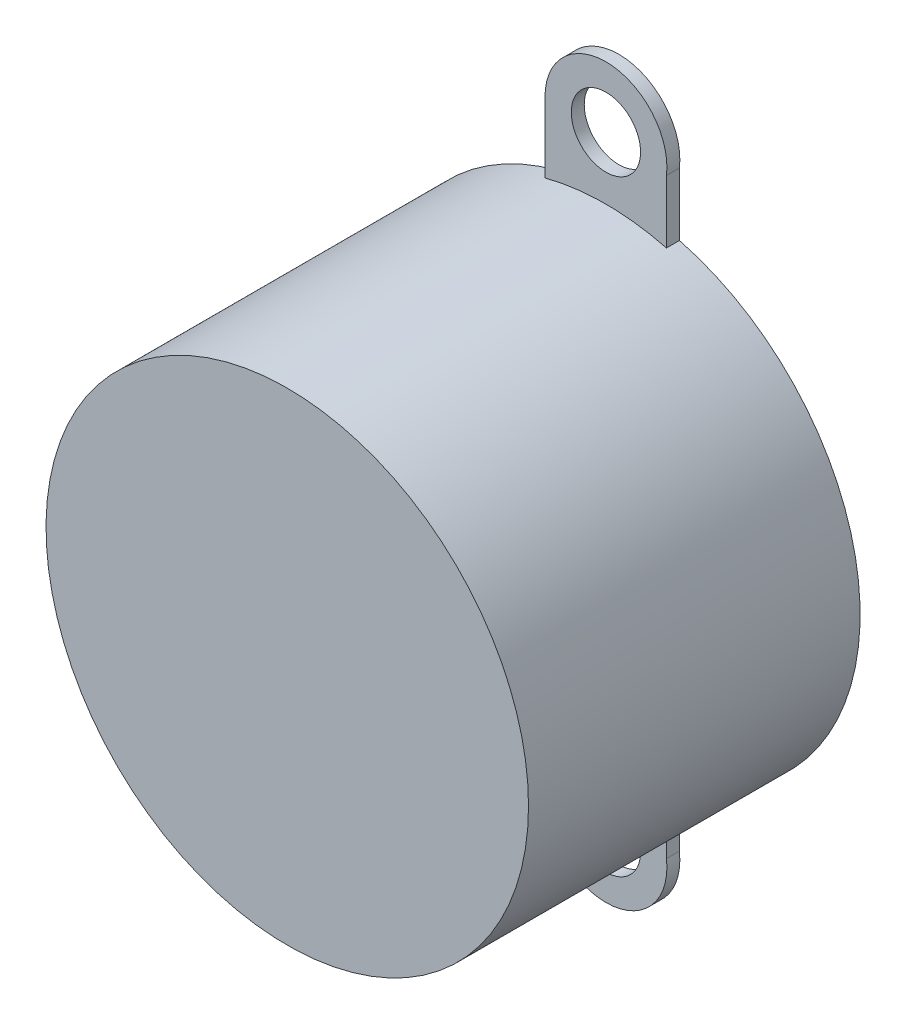
ISO-10303-21;
HEADER;
FILE_DESCRIPTION(('STEP AP214'),'2;1');
FILE_NAME('part.step','',(''),(''),'','','');
FILE_SCHEMA(('AUTOMOTIVE_DESIGN { 1 0 10303 214 1 1 1 1 }'));
ENDSEC;
DATA;
#1=APPLICATION_CONTEXT('core data for automotive mechanical design processes');
#2=APPLICATION_PROTOCOL_DEFINITION('international standard','automotive_design',2000,#1);
#3=PRODUCT_CONTEXT('',#1,'mechanical');
#4=PRODUCT('Part','Part','',(#3));
#5=PRODUCT_RELATED_PRODUCT_CATEGORY('part','',(#4));
#6=PRODUCT_DEFINITION_FORMATION('','',#4);
#7=PRODUCT_DEFINITION_CONTEXT('part definition',#1,'design');
#8=PRODUCT_DEFINITION('design','',#6,#7);
#9=PRODUCT_DEFINITION_SHAPE('','',#8);
#10=(LENGTH_UNIT() NAMED_UNIT(*) SI_UNIT(.MILLI.,.METRE.));
#11=(NAMED_UNIT(*) PLANE_ANGLE_UNIT() SI_UNIT($,.RADIAN.));
#12=(NAMED_UNIT(*) SI_UNIT($,.STERADIAN.) SOLID_ANGLE_UNIT());
#13=UNCERTAINTY_MEASURE_WITH_UNIT(LENGTH_MEASURE(1.E-05),#10,'distance_accuracy_value','');
#14=(GEOMETRIC_REPRESENTATION_CONTEXT(3) GLOBAL_UNCERTAINTY_ASSIGNED_CONTEXT((#13)) GLOBAL_UNIT_ASSIGNED_CONTEXT((#10,
#11,#12)) REPRESENTATION_CONTEXT('',''));
#15=CARTESIAN_POINT('',(0.,0.,0.));
#16=DIRECTION('',(0.,0.,1.));
#17=DIRECTION('',(1.,0.,0.));
#18=AXIS2_PLACEMENT_3D('',#15,#16,#17);
#19=CARTESIAN_POINT('',(-7.74683344083245,0.0508000000000002,-1.5748));
#20=DIRECTION('',(0.,0.,1.));
#21=DIRECTION('',(1.,0.,0.));
#22=AXIS2_PLACEMENT_3D('',#19,#20,#21);
#23=PLANE('',#22);
#24=CARTESIAN_POINT('',(-7.74683344083245,0.0508000000000002,-1.5748));
#25=DIRECTION('',(0.,0.,1.));
#26=DIRECTION('',(1.,0.,0.));
#27=AXIS2_PLACEMENT_3D('',#24,#25,#26);
#28=CIRCLE('',#27,4.5212);
#29=CARTESIAN_POINT('',(-3.22563344083245,0.0508000000000002,-1.5748));
#30=VERTEX_POINT('',#29);
#31=EDGE_CURVE('E256',#30,#30,#28,.T.);
#32=ORIENTED_EDGE('',*,*,#31,.F.);
#33=EDGE_LOOP('',(#32));
#34=FACE_BOUND('',#33,.T.);
#35=CARTESIAN_POINT('',(-7.74683344083245,0.0508000000000002,-1.5748));
#36=DIRECTION('',(0.,0.,1.));
#37=DIRECTION('',(1.,0.,0.));
#38=AXIS2_PLACEMENT_3D('',#35,#36,#37);
#39=CIRCLE('',#38,2.4511);
#40=CARTESIAN_POINT('',(-5.29573344083245,0.0508000000000002,-1.5748));
#41=VERTEX_POINT('',#40);
#42=EDGE_CURVE('E11',#41,#41,#39,.F.);
#43=ORIENTED_EDGE('',*,*,#42,.F.);
#44=EDGE_LOOP('',(#43));
#45=FACE_BOUND('',#44,.T.);
#46=ADVANCED_FACE('F34',(#34,#45),#23,.F.);
#47=CARTESIAN_POINT('',(0.,0.,19.2024));
#48=DIRECTION('',(0.,0.,-1.));
#49=DIRECTION('',(-1.,0.,0.));
#50=AXIS2_PLACEMENT_3D('',#47,#48,#49);
#51=CYLINDRICAL_SURFACE('',#50,13.97);
#52=CARTESIAN_POINT('',(0.,0.,19.2024));
#53=DIRECTION('',(0.,0.,1.));
#54=DIRECTION('',(1.,0.,0.));
#55=AXIS2_PLACEMENT_3D('',#52,#53,#54);
#56=CIRCLE('',#55,13.97);
#57=CARTESIAN_POINT('',(13.97,0.,19.2024));
#58=VERTEX_POINT('',#57);
#59=EDGE_CURVE('E42',#58,#58,#56,.T.);
#60=ORIENTED_EDGE('',*,*,#59,.F.);
#61=EDGE_LOOP('',(#60));
#62=FACE_BOUND('',#61,.T.);
#63=DIRECTION('',(0.,0.,-1.));
#64=VECTOR('',#63,1.);
#65=CARTESIAN_POINT('',(-3.5306,-13.5164996815004,0.7493));
#66=LINE('',#65,#64);
#67=CARTESIAN_POINT('',(-3.5306,-13.5164996815004,0.749300000000001));
#68=VERTEX_POINT('',#67);
#69=CARTESIAN_POINT('',(-3.5306,-13.5164996815004,0.));
#70=VERTEX_POINT('',#69);
#71=EDGE_CURVE('E54',#68,#70,#66,.T.);
#72=ORIENTED_EDGE('',*,*,#71,.F.);
#73=CARTESIAN_POINT('',(0.,0.,0.7493));
#74=DIRECTION('',(0.,0.,1.));
#75=DIRECTION('',(1.,0.,0.));
#76=AXIS2_PLACEMENT_3D('',#73,#74,#75);
#77=CIRCLE('',#76,13.97);
#78=CARTESIAN_POINT('',(3.5052,-13.5231088496691,0.749300000000001));
#79=VERTEX_POINT('',#78);
#80=EDGE_CURVE('E49',#68,#79,#77,.T.);
#81=ORIENTED_EDGE('',*,*,#80,.T.);
#82=DIRECTION('',(0.,0.,-1.));
#83=VECTOR('',#82,1.);
#84=CARTESIAN_POINT('',(3.5052,-13.5231088496691,0.7493));
#85=LINE('',#84,#83);
#86=CARTESIAN_POINT('',(3.5052,-13.5231088496691,0.));
#87=VERTEX_POINT('',#86);
#88=EDGE_CURVE('E126',#79,#87,#85,.T.);
#89=ORIENTED_EDGE('',*,*,#88,.T.);
#90=CARTESIAN_POINT('',(0.,0.,0.));
#91=DIRECTION('',(0.,0.,1.));
#92=DIRECTION('',(1.,0.,0.));
#93=AXIS2_PLACEMENT_3D('',#90,#91,#92);
#94=CIRCLE('',#93,13.97);
#95=CARTESIAN_POINT('',(3.5052,13.5231088496691,0.));
#96=VERTEX_POINT('',#95);
#97=EDGE_CURVE('E163',#87,#96,#94,.T.);
#98=ORIENTED_EDGE('',*,*,#97,.T.);
#99=DIRECTION('',(0.,0.,-1.));
#100=VECTOR('',#99,1.);
#101=CARTESIAN_POINT('',(3.5052,13.5231088496691,0.7493));
#102=LINE('',#101,#100);
#103=CARTESIAN_POINT('',(3.5052,13.5231088496691,0.749300000000001));
#104=VERTEX_POINT('',#103);
#105=EDGE_CURVE('E154',#104,#96,#102,.T.);
#106=ORIENTED_EDGE('',*,*,#105,.F.);
#107=CARTESIAN_POINT('',(0.,0.,0.7493));
#108=DIRECTION('',(0.,0.,1.));
#109=DIRECTION('',(1.,0.,0.));
#110=AXIS2_PLACEMENT_3D('',#107,#108,#109);
#111=CIRCLE('',#110,13.97);
#112=CARTESIAN_POINT('',(-3.5306,13.5164996815004,0.749300000000001));
#113=VERTEX_POINT('',#112);
#114=EDGE_CURVE('E137',#104,#113,#111,.T.);
#115=ORIENTED_EDGE('',*,*,#114,.T.);
#116=DIRECTION('',(0.,0.,-1.));
#117=VECTOR('',#116,1.);
#118=CARTESIAN_POINT('',(-3.5306,13.5164996815004,0.7493));
#119=LINE('',#118,#117);
#120=CARTESIAN_POINT('',(-3.5306,13.5164996815004,0.));
#121=VERTEX_POINT('',#120);
#122=EDGE_CURVE('E157',#113,#121,#119,.T.);
#123=ORIENTED_EDGE('',*,*,#122,.T.);
#124=EDGE_CURVE('E165',#121,#70,#94,.T.);
#125=ORIENTED_EDGE('',*,*,#124,.T.);
#126=EDGE_LOOP('',(#72,#81,#89,#98,#106,#115,#123,#125));
#127=FACE_BOUND('',#126,.T.);
#128=ADVANCED_FACE('F36',(#62,#127),#51,.T.);
#129=CARTESIAN_POINT('',(0.,0.,19.2024));
#130=DIRECTION('',(0.,0.,1.));
#131=DIRECTION('',(1.,0.,0.));
#132=AXIS2_PLACEMENT_3D('',#129,#130,#131);
#133=PLANE('',#132);
#134=ORIENTED_EDGE('',*,*,#59,.T.);
#135=EDGE_LOOP('',(#134));
#136=FACE_BOUND('',#135,.T.);
#137=ADVANCED_FACE('F202',(#136),#133,.T.);
#138=CARTESIAN_POINT('',(0.,0.,0.));
#139=DIRECTION('',(0.,0.,1.));
#140=DIRECTION('',(1.,0.,0.));
#141=AXIS2_PLACEMENT_3D('',#138,#139,#140);
#142=PLANE('',#141);
#143=CARTESIAN_POINT('',(-7.74683344083245,0.0508000000000002,0.));
#144=DIRECTION('',(0.,0.,1.));
#145=DIRECTION('',(1.,0.,0.));
#146=AXIS2_PLACEMENT_3D('',#143,#144,#145);
#147=CIRCLE('',#146,4.5212);
#148=CARTESIAN_POINT('',(-3.22563344083245,0.0508000000000002,0.));
#149=VERTEX_POINT('',#148);
#150=EDGE_CURVE('E258',#149,#149,#147,.T.);
#151=ORIENTED_EDGE('',*,*,#150,.T.);
#152=EDGE_LOOP('',(#151));
#153=FACE_BOUND('',#152,.T.);
#154=ORIENTED_EDGE('',*,*,#124,.F.);
#155=DIRECTION('',(0.,-1.,0.));
#156=VECTOR('',#155,1.);
#157=CARTESIAN_POINT('',(-3.5306,0.,0.));
#158=LINE('',#157,#156);
#159=CARTESIAN_POINT('',(-3.5306,17.5768,0.));
#160=VERTEX_POINT('',#159);
#161=EDGE_CURVE('E124',#160,#121,#158,.T.);
#162=ORIENTED_EDGE('',*,*,#161,.F.);
#163=CARTESIAN_POINT('',(0.,17.5768,0.));
#164=DIRECTION('',(0.,0.,1.));
#165=DIRECTION('',(1.,0.,0.));
#166=AXIS2_PLACEMENT_3D('',#163,#164,#165);
#167=CIRCLE('',#166,3.5306);
#168=CARTESIAN_POINT('',(3.5052,17.1540597487818,0.));
#169=VERTEX_POINT('',#168);
#170=EDGE_CURVE('E121',#169,#160,#167,.T.);
#171=ORIENTED_EDGE('',*,*,#170,.F.);
#172=DIRECTION('',(0.,-1.,0.));
#173=VECTOR('',#172,1.);
#174=CARTESIAN_POINT('',(3.5052,0.,0.));
#175=LINE('',#174,#173);
#176=EDGE_CURVE('E148',#169,#96,#175,.T.);
#177=ORIENTED_EDGE('',*,*,#176,.T.);
#178=ORIENTED_EDGE('',*,*,#97,.F.);
#179=DIRECTION('',(0.,-1.,0.));
#180=VECTOR('',#179,1.);
#181=CARTESIAN_POINT('',(3.5052,0.,0.));
#182=LINE('',#181,#180);
#183=CARTESIAN_POINT('',(3.5052,-17.1032597487819,0.));
#184=VERTEX_POINT('',#183);
#185=EDGE_CURVE('E243',#87,#184,#182,.T.);
#186=ORIENTED_EDGE('',*,*,#185,.T.);
#187=CARTESIAN_POINT('',(0.,-17.526,0.));
#188=DIRECTION('',(0.,0.,1.));
#189=DIRECTION('',(1.,0.,0.));
#190=AXIS2_PLACEMENT_3D('',#187,#188,#189);
#191=CIRCLE('',#190,3.5306);
#192=CARTESIAN_POINT('',(-3.5306,-17.526,0.));
#193=VERTEX_POINT('',#192);
#194=EDGE_CURVE('E245',#193,#184,#191,.T.);
#195=ORIENTED_EDGE('',*,*,#194,.F.);
#196=DIRECTION('',(0.,-1.,0.));
#197=VECTOR('',#196,1.);
#198=CARTESIAN_POINT('',(-3.5306,0.,0.));
#199=LINE('',#198,#197);
#200=EDGE_CURVE('E120',#70,#193,#199,.T.);
#201=ORIENTED_EDGE('',*,*,#200,.F.);
#202=EDGE_LOOP('',(#154,#162,#171,#177,#178,#186,#195,#201));
#203=FACE_BOUND('',#202,.T.);
#204=CARTESIAN_POINT('',(0.,17.5768,0.));
#205=DIRECTION('',(0.,0.,1.));
#206=DIRECTION('',(1.,0.,0.));
#207=AXIS2_PLACEMENT_3D('',#204,#205,#206);
#208=CIRCLE('',#207,2.0066);
#209=CARTESIAN_POINT('',(-2.0066,17.5768,0.));
#210=VERTEX_POINT('',#209);
#211=EDGE_CURVE('E134',#210,#210,#208,.T.);
#212=ORIENTED_EDGE('',*,*,#211,.T.);
#213=EDGE_LOOP('',(#212));
#214=FACE_BOUND('',#213,.T.);
#215=CARTESIAN_POINT('',(0.,-17.526,0.));
#216=DIRECTION('',(0.,0.,1.));
#217=DIRECTION('',(1.,0.,0.));
#218=AXIS2_PLACEMENT_3D('',#215,#216,#217);
#219=CIRCLE('',#218,2.0066);
#220=CARTESIAN_POINT('',(-2.0066,-17.526,0.));
#221=VERTEX_POINT('',#220);
#222=EDGE_CURVE('E116',#221,#221,#219,.T.);
#223=ORIENTED_EDGE('',*,*,#222,.T.);
#224=EDGE_LOOP('',(#223));
#225=FACE_BOUND('',#224,.T.);
#226=ADVANCED_FACE('F175',(#153,#203,#214,#225),#142,.F.);
#227=CARTESIAN_POINT('',(0.,17.5768,0.7493));
#228=DIRECTION('',(0.,0.,-1.));
#229=DIRECTION('',(-1.,0.,0.));
#230=AXIS2_PLACEMENT_3D('',#227,#228,#229);
#231=CYLINDRICAL_SURFACE('',#230,3.5306);
#232=ORIENTED_EDGE('',*,*,#170,.T.);
#233=DIRECTION('',(0.,0.,-1.));
#234=VECTOR('',#233,1.);
#235=CARTESIAN_POINT('',(-3.5306,17.5768,0.7493));
#236=LINE('',#235,#234);
#237=CARTESIAN_POINT('',(-3.5306,17.5768,0.7493));
#238=VERTEX_POINT('',#237);
#239=EDGE_CURVE('E160',#238,#160,#236,.T.);
#240=ORIENTED_EDGE('',*,*,#239,.F.);
#241=CARTESIAN_POINT('',(0.,17.5768,0.7493));
#242=DIRECTION('',(0.,0.,1.));
#243=DIRECTION('',(1.,0.,0.));
#244=AXIS2_PLACEMENT_3D('',#241,#242,#243);
#245=CIRCLE('',#244,3.5306);
#246=CARTESIAN_POINT('',(3.5052,17.1540597487818,0.7493));
#247=VERTEX_POINT('',#246);
#248=EDGE_CURVE('E130',#247,#238,#245,.T.);
#249=ORIENTED_EDGE('',*,*,#248,.F.);
#250=DIRECTION('',(0.,0.,-1.));
#251=VECTOR('',#250,1.);
#252=CARTESIAN_POINT('',(3.5052,17.1540597487818,0.7493));
#253=LINE('',#252,#251);
#254=EDGE_CURVE('E144',#247,#169,#253,.T.);
#255=ORIENTED_EDGE('',*,*,#254,.T.);
#256=EDGE_LOOP('',(#232,#240,#249,#255));
#257=FACE_BOUND('',#256,.T.);
#258=ADVANCED_FACE('F179',(#257),#231,.T.);
#259=CARTESIAN_POINT('',(-3.5306,0.,0.7493));
#260=DIRECTION('',(1.,0.,0.));
#261=DIRECTION('',(0.,1.,0.));
#262=AXIS2_PLACEMENT_3D('',#259,#260,#261);
#263=PLANE('',#262);
#264=ORIENTED_EDGE('',*,*,#161,.T.);
#265=ORIENTED_EDGE('',*,*,#122,.F.);
#266=DIRECTION('',(0.,-1.,0.));
#267=VECTOR('',#266,1.);
#268=CARTESIAN_POINT('',(-3.5306,0.,0.7493));
#269=LINE('',#268,#267);
#270=EDGE_CURVE('E133',#238,#113,#269,.T.);
#271=ORIENTED_EDGE('',*,*,#270,.F.);
#272=ORIENTED_EDGE('',*,*,#239,.T.);
#273=EDGE_LOOP('',(#264,#265,#271,#272));
#274=FACE_BOUND('',#273,.T.);
#275=ADVANCED_FACE('F186',(#274),#263,.F.);
#276=CARTESIAN_POINT('',(3.5052,0.,0.7493));
#277=DIRECTION('',(1.,0.,0.));
#278=DIRECTION('',(0.,1.,0.));
#279=AXIS2_PLACEMENT_3D('',#276,#277,#278);
#280=PLANE('',#279);
#281=ORIENTED_EDGE('',*,*,#176,.F.);
#282=ORIENTED_EDGE('',*,*,#254,.F.);
#283=DIRECTION('',(0.,-1.,0.));
#284=VECTOR('',#283,1.);
#285=CARTESIAN_POINT('',(3.5052,0.,0.7493));
#286=LINE('',#285,#284);
#287=EDGE_CURVE('E139',#247,#104,#286,.T.);
#288=ORIENTED_EDGE('',*,*,#287,.T.);
#289=ORIENTED_EDGE('',*,*,#105,.T.);
#290=EDGE_LOOP('',(#281,#282,#288,#289));
#291=FACE_BOUND('',#290,.T.);
#292=ADVANCED_FACE('F172',(#291),#280,.T.);
#293=CARTESIAN_POINT('',(0.,17.5768,0.7493));
#294=DIRECTION('',(0.,0.,-1.));
#295=DIRECTION('',(-1.,0.,0.));
#296=AXIS2_PLACEMENT_3D('',#293,#294,#295);
#297=CYLINDRICAL_SURFACE('',#296,2.0066);
#298=CARTESIAN_POINT('',(0.,17.5768,0.7493));
#299=DIRECTION('',(0.,0.,1.));
#300=DIRECTION('',(1.,0.,0.));
#301=AXIS2_PLACEMENT_3D('',#298,#299,#300);
#302=CIRCLE('',#301,2.0066);
#303=CARTESIAN_POINT('',(-2.0066,17.5768,0.7493));
#304=VERTEX_POINT('',#303);
#305=EDGE_CURVE('E142',#304,#304,#302,.T.);
#306=CARTESIAN_POINT('',(-2.0066,17.5768,0.7493));
#307=CARTESIAN_POINT('',(-2.0066,17.5768,0.741494791666667));
#308=CARTESIAN_POINT('',(-2.0066,17.5768,0.733689583333333));
#309=CARTESIAN_POINT('',(-2.0066,17.5768,0.718079166666666));
#310=CARTESIAN_POINT('',(-2.0066,17.5768,0.710273958333333));
#311=CARTESIAN_POINT('',(-2.0066,17.5768,0.694663541666667));
#312=CARTESIAN_POINT('',(-2.0066,17.5768,0.686858333333333));
#313=CARTESIAN_POINT('',(-2.0066,17.5768,0.671247916666666));
#314=CARTESIAN_POINT('',(-2.0066,17.5768,0.663442708333333));
#315=CARTESIAN_POINT('',(-2.0066,17.5768,0.647832291666667));
#316=CARTESIAN_POINT('',(-2.0066,17.5768,0.640027083333333));
#317=CARTESIAN_POINT('',(-2.0066,17.5768,0.624416666666667));
#318=CARTESIAN_POINT('',(-2.0066,17.5768,0.616611458333333));
#319=CARTESIAN_POINT('',(-2.0066,17.5768,0.601001041666667));
#320=CARTESIAN_POINT('',(-2.0066,17.5768,0.593195833333333));
#321=CARTESIAN_POINT('',(-2.0066,17.5768,0.577585416666667));
#322=CARTESIAN_POINT('',(-2.0066,17.5768,0.569780208333333));
#323=CARTESIAN_POINT('',(-2.0066,17.5768,0.554169791666667));
#324=CARTESIAN_POINT('',(-2.0066,17.5768,0.546364583333333));
#325=CARTESIAN_POINT('',(-2.0066,17.5768,0.530754166666667));
#326=CARTESIAN_POINT('',(-2.0066,17.5768,0.522948958333333));
#327=CARTESIAN_POINT('',(-2.0066,17.5768,0.507338541666667));
#328=CARTESIAN_POINT('',(-2.0066,17.5768,0.499533333333333));
#329=CARTESIAN_POINT('',(-2.0066,17.5768,0.483922916666667));
#330=CARTESIAN_POINT('',(-2.0066,17.5768,0.476117708333333));
#331=CARTESIAN_POINT('',(-2.0066,17.5768,0.460507291666667));
#332=CARTESIAN_POINT('',(-2.0066,17.5768,0.452702083333333));
#333=CARTESIAN_POINT('',(-2.0066,17.5768,0.437091666666667));
#334=CARTESIAN_POINT('',(-2.0066,17.5768,0.429286458333333));
#335=CARTESIAN_POINT('',(-2.0066,17.5768,0.413676041666667));
#336=CARTESIAN_POINT('',(-2.0066,17.5768,0.405870833333333));
#337=CARTESIAN_POINT('',(-2.0066,17.5768,0.390260416666667));
#338=CARTESIAN_POINT('',(-2.0066,17.5768,0.382455208333333));
#339=CARTESIAN_POINT('',(-2.0066,17.5768,0.366844791666667));
#340=CARTESIAN_POINT('',(-2.0066,17.5768,0.359039583333333));
#341=CARTESIAN_POINT('',(-2.0066,17.5768,0.343429166666667));
#342=CARTESIAN_POINT('',(-2.0066,17.5768,0.335623958333333));
#343=CARTESIAN_POINT('',(-2.0066,17.5768,0.320013541666667));
#344=CARTESIAN_POINT('',(-2.0066,17.5768,0.312208333333333));
#345=CARTESIAN_POINT('',(-2.0066,17.5768,0.296597916666667));
#346=CARTESIAN_POINT('',(-2.0066,17.5768,0.288792708333333));
#347=CARTESIAN_POINT('',(-2.0066,17.5768,0.273182291666667));
#348=CARTESIAN_POINT('',(-2.0066,17.5768,0.265377083333333));
#349=CARTESIAN_POINT('',(-2.0066,17.5768,0.249766666666667));
#350=CARTESIAN_POINT('',(-2.0066,17.5768,0.241961458333333));
#351=CARTESIAN_POINT('',(-2.0066,17.5768,0.226351041666667));
#352=CARTESIAN_POINT('',(-2.0066,17.5768,0.218545833333333));
#353=CARTESIAN_POINT('',(-2.0066,17.5768,0.202935416666667));
#354=CARTESIAN_POINT('',(-2.0066,17.5768,0.195130208333333));
#355=CARTESIAN_POINT('',(-2.0066,17.5768,0.179519791666667));
#356=CARTESIAN_POINT('',(-2.0066,17.5768,0.171714583333333));
#357=CARTESIAN_POINT('',(-2.0066,17.5768,0.156104166666667));
#358=CARTESIAN_POINT('',(-2.0066,17.5768,0.148298958333333));
#359=CARTESIAN_POINT('',(-2.0066,17.5768,0.132688541666667));
#360=CARTESIAN_POINT('',(-2.0066,17.5768,0.124883333333333));
#361=CARTESIAN_POINT('',(-2.0066,17.5768,0.109272916666667));
#362=CARTESIAN_POINT('',(-2.0066,17.5768,0.101467708333333));
#363=CARTESIAN_POINT('',(-2.0066,17.5768,0.0858572916666666));
#364=CARTESIAN_POINT('',(-2.0066,17.5768,0.0780520833333333));
#365=CARTESIAN_POINT('',(-2.0066,17.5768,0.0624416666666667));
#366=CARTESIAN_POINT('',(-2.0066,17.5768,0.0546364583333333));
#367=CARTESIAN_POINT('',(-2.0066,17.5768,0.0390260416666667));
#368=CARTESIAN_POINT('',(-2.0066,17.5768,0.0312208333333334));
#369=CARTESIAN_POINT('',(-2.0066,17.5768,0.0156104166666667));
#370=CARTESIAN_POINT('',(-2.0066,17.5768,0.00780520833333333));
#371=CARTESIAN_POINT('',(-2.0066,17.5768,0.));
#372=B_SPLINE_CURVE_WITH_KNOTS('',3,(#306,#307,#308,#309,#310,#311,#312,#313,#314,#315,#316,
#317,#318,#319,#320,#321,#322,#323,#324,#325,#326,#327,#328,#329,#330,#331,#332,#333,#334,#335,
#336,#337,#338,#339,#340,#341,#342,#343,#344,#345,#346,#347,#348,#349,#350,#351,#352,#353,#354,
#355,#356,#357,#358,#359,#360,#361,#362,#363,#364,#365,#366,#367,#368,#369,#370,#371),
.UNSPECIFIED.,.F.,.F.,(4,2,2,2,2,2,2,2,2,2,2,2,2,2,2,2,2,2,2,2,2,2,2,2,2,2,2,2,2,2,2,2,4),(0.,
0.0234156249999999,0.04683125,0.0702468749999999,0.0936625,0.117078125,0.14049375,0.163909375,
0.187325,0.210740625,0.23415625,0.257571875,0.2809875,0.304403125,0.32781875,0.351234375,
0.37465,0.398065625,0.42148125,0.444896875,0.4683125,0.491728125,0.51514375,0.538559375,
0.561975,0.585390625,0.60880625,0.632221875,0.6556375,0.679053125,0.70246875,0.725884375,
0.7493),.UNSPECIFIED.);
#373=EDGE_CURVE('BSEAM193',#304,#210,#372,.T.);
#374=ORIENTED_EDGE('',*,*,#305,.T.);
#375=ORIENTED_EDGE('',*,*,#211,.F.);
#376=ORIENTED_EDGE('',*,*,#373,.T.);
#377=ORIENTED_EDGE('',*,*,#373,.F.);
#378=EDGE_LOOP('',(#374,#376,#375,#377));
#379=FACE_BOUND('',#378,.T.);
#380=ADVANCED_FACE('F193',(#379),#297,.F.);
#381=CARTESIAN_POINT('',(0.,0.,0.7493));
#382=DIRECTION('',(0.,0.,1.));
#383=DIRECTION('',(1.,0.,0.));
#384=AXIS2_PLACEMENT_3D('',#381,#382,#383);
#385=PLANE('',#384);
#386=ORIENTED_EDGE('',*,*,#248,.T.);
#387=ORIENTED_EDGE('',*,*,#270,.T.);
#388=ORIENTED_EDGE('',*,*,#114,.F.);
#389=ORIENTED_EDGE('',*,*,#287,.F.);
#390=EDGE_LOOP('',(#386,#387,#388,#389));
#391=FACE_BOUND('',#390,.T.);
#392=ORIENTED_EDGE('',*,*,#305,.F.);
#393=EDGE_LOOP('',(#392));
#394=FACE_BOUND('',#393,.T.);
#395=ADVANCED_FACE('F182',(#391,#394),#385,.T.);
#396=CARTESIAN_POINT('',(-3.5306,0.,0.7493));
#397=DIRECTION('',(1.,0.,0.));
#398=DIRECTION('',(0.,1.,0.));
#399=AXIS2_PLACEMENT_3D('',#396,#397,#398);
#400=PLANE('',#399);
#401=ORIENTED_EDGE('',*,*,#200,.T.);
#402=DIRECTION('',(0.,0.,-1.));
#403=VECTOR('',#402,1.);
#404=CARTESIAN_POINT('',(-3.5306,-17.526,0.7493));
#405=LINE('',#404,#403);
#406=CARTESIAN_POINT('',(-3.5306,-17.526,0.7493));
#407=VERTEX_POINT('',#406);
#408=EDGE_CURVE('E104',#407,#193,#405,.T.);
#409=ORIENTED_EDGE('',*,*,#408,.F.);
#410=DIRECTION('',(0.,-1.,0.));
#411=VECTOR('',#410,1.);
#412=CARTESIAN_POINT('',(-3.5306,0.,0.7493));
#413=LINE('',#412,#411);
#414=EDGE_CURVE('E111',#68,#407,#413,.T.);
#415=ORIENTED_EDGE('',*,*,#414,.F.);
#416=ORIENTED_EDGE('',*,*,#71,.T.);
#417=EDGE_LOOP('',(#401,#409,#415,#416));
#418=FACE_BOUND('',#417,.T.);
#419=ADVANCED_FACE('F118',(#418),#400,.F.);
#420=CARTESIAN_POINT('',(0.,-17.526,0.7493));
#421=DIRECTION('',(0.,0.,-1.));
#422=DIRECTION('',(-1.,0.,0.));
#423=AXIS2_PLACEMENT_3D('',#420,#421,#422);
#424=CYLINDRICAL_SURFACE('',#423,3.5306);
#425=ORIENTED_EDGE('',*,*,#194,.T.);
#426=DIRECTION('',(0.,0.,-1.));
#427=VECTOR('',#426,1.);
#428=CARTESIAN_POINT('',(3.5052,-17.1032597487819,0.7493));
#429=LINE('',#428,#427);
#430=CARTESIAN_POINT('',(3.5052,-17.1032597487819,0.7493));
#431=VERTEX_POINT('',#430);
#432=EDGE_CURVE('E106',#431,#184,#429,.T.);
#433=ORIENTED_EDGE('',*,*,#432,.F.);
#434=CARTESIAN_POINT('',(0.,-17.526,0.7493));
#435=DIRECTION('',(0.,0.,1.));
#436=DIRECTION('',(1.,0.,0.));
#437=AXIS2_PLACEMENT_3D('',#434,#435,#436);
#438=CIRCLE('',#437,3.5306);
#439=EDGE_CURVE('E99',#407,#431,#438,.T.);
#440=ORIENTED_EDGE('',*,*,#439,.F.);
#441=ORIENTED_EDGE('',*,*,#408,.T.);
#442=EDGE_LOOP('',(#425,#433,#440,#441));
#443=FACE_BOUND('',#442,.T.);
#444=ADVANCED_FACE('F102',(#443),#424,.T.);
#445=CARTESIAN_POINT('',(3.5052,0.,0.7493));
#446=DIRECTION('',(1.,0.,0.));
#447=DIRECTION('',(0.,1.,0.));
#448=AXIS2_PLACEMENT_3D('',#445,#446,#447);
#449=PLANE('',#448);
#450=ORIENTED_EDGE('',*,*,#185,.F.);
#451=ORIENTED_EDGE('',*,*,#88,.F.);
#452=DIRECTION('',(0.,-1.,0.));
#453=VECTOR('',#452,1.);
#454=CARTESIAN_POINT('',(3.5052,0.,0.7493));
#455=LINE('',#454,#453);
#456=EDGE_CURVE('E110',#79,#431,#455,.T.);
#457=ORIENTED_EDGE('',*,*,#456,.T.);
#458=ORIENTED_EDGE('',*,*,#432,.T.);
#459=EDGE_LOOP('',(#450,#451,#457,#458));
#460=FACE_BOUND('',#459,.T.);
#461=ADVANCED_FACE('F219',(#460),#449,.T.);
#462=CARTESIAN_POINT('',(0.,-17.526,0.7493));
#463=DIRECTION('',(0.,0.,-1.));
#464=DIRECTION('',(-1.,0.,0.));
#465=AXIS2_PLACEMENT_3D('',#462,#463,#464);
#466=CYLINDRICAL_SURFACE('',#465,2.0066);
#467=CARTESIAN_POINT('',(0.,-17.526,0.7493));
#468=DIRECTION('',(0.,0.,1.));
#469=DIRECTION('',(1.,0.,0.));
#470=AXIS2_PLACEMENT_3D('',#467,#468,#469);
#471=CIRCLE('',#470,2.0066);
#472=CARTESIAN_POINT('',(-2.0066,-17.526,0.7493));
#473=VERTEX_POINT('',#472);
#474=EDGE_CURVE('E249',#473,#473,#471,.T.);
#475=CARTESIAN_POINT('',(-2.0066,-17.526,0.7493));
#476=CARTESIAN_POINT('',(-2.0066,-17.526,0.741494791666667));
#477=CARTESIAN_POINT('',(-2.0066,-17.526,0.733689583333333));
#478=CARTESIAN_POINT('',(-2.0066,-17.526,0.718079166666666));
#479=CARTESIAN_POINT('',(-2.0066,-17.526,0.710273958333333));
#480=CARTESIAN_POINT('',(-2.0066,-17.526,0.694663541666667));
#481=CARTESIAN_POINT('',(-2.0066,-17.526,0.686858333333333));
#482=CARTESIAN_POINT('',(-2.0066,-17.526,0.671247916666666));
#483=CARTESIAN_POINT('',(-2.0066,-17.526,0.663442708333333));
#484=CARTESIAN_POINT('',(-2.0066,-17.526,0.647832291666667));
#485=CARTESIAN_POINT('',(-2.0066,-17.526,0.640027083333333));
#486=CARTESIAN_POINT('',(-2.0066,-17.526,0.624416666666667));
#487=CARTESIAN_POINT('',(-2.0066,-17.526,0.616611458333333));
#488=CARTESIAN_POINT('',(-2.0066,-17.526,0.601001041666667));
#489=CARTESIAN_POINT('',(-2.0066,-17.526,0.593195833333333));
#490=CARTESIAN_POINT('',(-2.0066,-17.526,0.577585416666667));
#491=CARTESIAN_POINT('',(-2.0066,-17.526,0.569780208333333));
#492=CARTESIAN_POINT('',(-2.0066,-17.526,0.554169791666667));
#493=CARTESIAN_POINT('',(-2.0066,-17.526,0.546364583333333));
#494=CARTESIAN_POINT('',(-2.0066,-17.526,0.530754166666667));
#495=CARTESIAN_POINT('',(-2.0066,-17.526,0.522948958333333));
#496=CARTESIAN_POINT('',(-2.0066,-17.526,0.507338541666667));
#497=CARTESIAN_POINT('',(-2.0066,-17.526,0.499533333333333));
#498=CARTESIAN_POINT('',(-2.0066,-17.526,0.483922916666667));
#499=CARTESIAN_POINT('',(-2.0066,-17.526,0.476117708333333));
#500=CARTESIAN_POINT('',(-2.0066,-17.526,0.460507291666667));
#501=CARTESIAN_POINT('',(-2.0066,-17.526,0.452702083333333));
#502=CARTESIAN_POINT('',(-2.0066,-17.526,0.437091666666667));
#503=CARTESIAN_POINT('',(-2.0066,-17.526,0.429286458333333));
#504=CARTESIAN_POINT('',(-2.0066,-17.526,0.413676041666667));
#505=CARTESIAN_POINT('',(-2.0066,-17.526,0.405870833333333));
#506=CARTESIAN_POINT('',(-2.0066,-17.526,0.390260416666667));
#507=CARTESIAN_POINT('',(-2.0066,-17.526,0.382455208333333));
#508=CARTESIAN_POINT('',(-2.0066,-17.526,0.366844791666667));
#509=CARTESIAN_POINT('',(-2.0066,-17.526,0.359039583333333));
#510=CARTESIAN_POINT('',(-2.0066,-17.526,0.343429166666667));
#511=CARTESIAN_POINT('',(-2.0066,-17.526,0.335623958333333));
#512=CARTESIAN_POINT('',(-2.0066,-17.526,0.320013541666667));
#513=CARTESIAN_POINT('',(-2.0066,-17.526,0.312208333333333));
#514=CARTESIAN_POINT('',(-2.0066,-17.526,0.296597916666667));
#515=CARTESIAN_POINT('',(-2.0066,-17.526,0.288792708333333));
#516=CARTESIAN_POINT('',(-2.0066,-17.526,0.273182291666667));
#517=CARTESIAN_POINT('',(-2.0066,-17.526,0.265377083333333));
#518=CARTESIAN_POINT('',(-2.0066,-17.526,0.249766666666667));
#519=CARTESIAN_POINT('',(-2.0066,-17.526,0.241961458333333));
#520=CARTESIAN_POINT('',(-2.0066,-17.526,0.226351041666667));
#521=CARTESIAN_POINT('',(-2.0066,-17.526,0.218545833333333));
#522=CARTESIAN_POINT('',(-2.0066,-17.526,0.202935416666667));
#523=CARTESIAN_POINT('',(-2.0066,-17.526,0.195130208333333));
#524=CARTESIAN_POINT('',(-2.0066,-17.526,0.179519791666667));
#525=CARTESIAN_POINT('',(-2.0066,-17.526,0.171714583333333));
#526=CARTESIAN_POINT('',(-2.0066,-17.526,0.156104166666667));
#527=CARTESIAN_POINT('',(-2.0066,-17.526,0.148298958333333));
#528=CARTESIAN_POINT('',(-2.0066,-17.526,0.132688541666667));
#529=CARTESIAN_POINT('',(-2.0066,-17.526,0.124883333333333));
#530=CARTESIAN_POINT('',(-2.0066,-17.526,0.109272916666667));
#531=CARTESIAN_POINT('',(-2.0066,-17.526,0.101467708333333));
#532=CARTESIAN_POINT('',(-2.0066,-17.526,0.0858572916666666));
#533=CARTESIAN_POINT('',(-2.0066,-17.526,0.0780520833333333));
#534=CARTESIAN_POINT('',(-2.0066,-17.526,0.0624416666666667));
#535=CARTESIAN_POINT('',(-2.0066,-17.526,0.0546364583333333));
#536=CARTESIAN_POINT('',(-2.0066,-17.526,0.0390260416666667));
#537=CARTESIAN_POINT('',(-2.0066,-17.526,0.0312208333333334));
#538=CARTESIAN_POINT('',(-2.0066,-17.526,0.0156104166666667));
#539=CARTESIAN_POINT('',(-2.0066,-17.526,0.00780520833333333));
#540=CARTESIAN_POINT('',(-2.0066,-17.526,0.));
#541=B_SPLINE_CURVE_WITH_KNOTS('',3,(#475,#476,#477,#478,#479,#480,#481,#482,#483,#484,#485,
#486,#487,#488,#489,#490,#491,#492,#493,#494,#495,#496,#497,#498,#499,#500,#501,#502,#503,#504,
#505,#506,#507,#508,#509,#510,#511,#512,#513,#514,#515,#516,#517,#518,#519,#520,#521,#522,#523,
#524,#525,#526,#527,#528,#529,#530,#531,#532,#533,#534,#535,#536,#537,#538,#539,#540),
.UNSPECIFIED.,.F.,.F.,(4,2,2,2,2,2,2,2,2,2,2,2,2,2,2,2,2,2,2,2,2,2,2,2,2,2,2,2,2,2,2,2,4),(0.,
0.0234156249999999,0.04683125,0.0702468749999999,0.0936625,0.117078125,0.14049375,0.163909375,
0.187325,0.210740625,0.23415625,0.257571875,0.2809875,0.304403125,0.32781875,0.351234375,
0.37465,0.398065625,0.42148125,0.444896875,0.4683125,0.491728125,0.51514375,0.538559375,
0.561975,0.585390625,0.60880625,0.632221875,0.6556375,0.679053125,0.70246875,0.725884375,
0.7493),.UNSPECIFIED.);
#542=EDGE_CURVE('BSEAM216',#473,#221,#541,.T.);
#543=ORIENTED_EDGE('',*,*,#474,.T.);
#544=ORIENTED_EDGE('',*,*,#222,.F.);
#545=ORIENTED_EDGE('',*,*,#542,.T.);
#546=ORIENTED_EDGE('',*,*,#542,.F.);
#547=EDGE_LOOP('',(#543,#545,#544,#546));
#548=FACE_BOUND('',#547,.T.);
#549=ADVANCED_FACE('F216',(#548),#466,.F.);
#550=CARTESIAN_POINT('',(0.,0.,0.7493));
#551=DIRECTION('',(0.,0.,1.));
#552=DIRECTION('',(1.,0.,0.));
#553=AXIS2_PLACEMENT_3D('',#550,#551,#552);
#554=PLANE('',#553);
#555=ORIENTED_EDGE('',*,*,#414,.T.);
#556=ORIENTED_EDGE('',*,*,#439,.T.);
#557=ORIENTED_EDGE('',*,*,#456,.F.);
#558=ORIENTED_EDGE('',*,*,#80,.F.);
#559=EDGE_LOOP('',(#555,#556,#557,#558));
#560=FACE_BOUND('',#559,.T.);
#561=ORIENTED_EDGE('',*,*,#474,.F.);
#562=EDGE_LOOP('',(#561));
#563=FACE_BOUND('',#562,.T.);
#564=ADVANCED_FACE('F113',(#560,#563),#554,.T.);
#565=CARTESIAN_POINT('',(-7.74683344083245,0.0508000000000002,-1.5748));
#566=DIRECTION('',(0.,0.,1.));
#567=DIRECTION('',(1.,0.,0.));
#568=AXIS2_PLACEMENT_3D('',#565,#566,#567);
#569=CYLINDRICAL_SURFACE('',#568,4.5212);
#570=ORIENTED_EDGE('',*,*,#31,.T.);
#571=EDGE_LOOP('',(#570));
#572=FACE_BOUND('',#571,.T.);
#573=ORIENTED_EDGE('',*,*,#150,.F.);
#574=EDGE_LOOP('',(#573));
#575=FACE_BOUND('',#574,.T.);
#576=ADVANCED_FACE('F210',(#572,#575),#569,.T.);
#577=CARTESIAN_POINT('',(-7.74683344083245,0.0508000000000002,-9.906));
#578=DIRECTION('',(0.,0.,1.));
#579=DIRECTION('',(1.,0.,0.));
#580=AXIS2_PLACEMENT_3D('',#577,#578,#579);
#581=CYLINDRICAL_SURFACE('',#580,2.4511);
#582=CARTESIAN_POINT('',(-7.74683344083245,0.0508000000000002,-9.906));
#583=DIRECTION('',(0.,0.,-1.));
#584=DIRECTION('',(-1.,0.,0.));
#585=AXIS2_PLACEMENT_3D('',#582,#583,#584);
#586=CIRCLE('',#585,2.4511);
#587=CARTESIAN_POINT('',(-10.1979334408325,0.0508000000000002,-9.906));
#588=VERTEX_POINT('',#587);
#589=EDGE_CURVE('E261',#588,#588,#586,.T.);
#590=ORIENTED_EDGE('',*,*,#589,.F.);
#591=EDGE_LOOP('',(#590));
#592=FACE_BOUND('',#591,.T.);
#593=ORIENTED_EDGE('',*,*,#42,.T.);
#594=EDGE_LOOP('',(#593));
#595=FACE_BOUND('',#594,.T.);
#596=ADVANCED_FACE('F208',(#592,#595),#581,.T.);
#597=CARTESIAN_POINT('',(-7.74683344083245,0.0508000000000002,-9.906));
#598=DIRECTION('',(0.,0.,-1.));
#599=DIRECTION('',(-1.,0.,0.));
#600=AXIS2_PLACEMENT_3D('',#597,#598,#599);
#601=PLANE('',#600);
#602=ORIENTED_EDGE('',*,*,#589,.T.);
#603=EDGE_LOOP('',(#602));
#604=FACE_BOUND('',#603,.T.);
#605=ADVANCED_FACE('F267',(#604),#601,.T.);
#606=CLOSED_SHELL('',(#46,#128,#137,#226,#258,#275,#292,#380,#395,#419,#444,#461,#549,#564,#576,
#596,#605));
#607=MANIFOLD_SOLID_BREP('B2',#606);
#608=ADVANCED_BREP_SHAPE_REPRESENTATION('',(#18,#607),#14);
#609=SHAPE_DEFINITION_REPRESENTATION(#9,#608);
ENDSEC;
END-ISO-10303-21;
